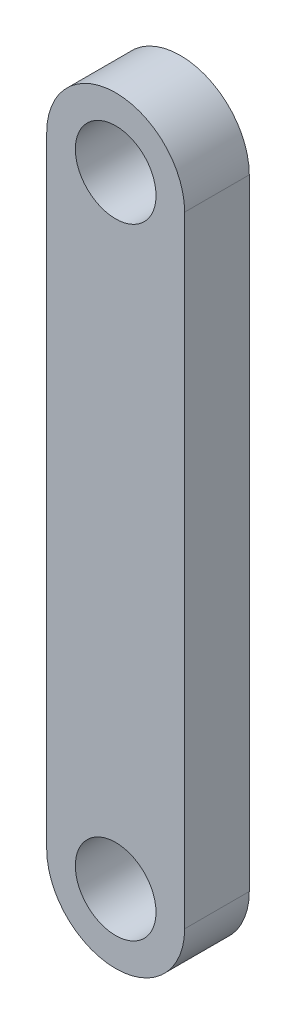
ISO-10303-21;
HEADER;
FILE_DESCRIPTION(('STEP AP214'),'2;1');
FILE_NAME('part.step','',(''),(''),'','','');
FILE_SCHEMA(('AUTOMOTIVE_DESIGN { 1 0 10303 214 1 1 1 1 }'));
ENDSEC;
DATA;
#1=APPLICATION_CONTEXT('core data for automotive mechanical design processes');
#2=APPLICATION_PROTOCOL_DEFINITION('international standard','automotive_design',2000,#1);
#3=PRODUCT_CONTEXT('',#1,'mechanical');
#4=PRODUCT('Part','Part','',(#3));
#5=PRODUCT_RELATED_PRODUCT_CATEGORY('part','',(#4));
#6=PRODUCT_DEFINITION_FORMATION('','',#4);
#7=PRODUCT_DEFINITION_CONTEXT('part definition',#1,'design');
#8=PRODUCT_DEFINITION('design','',#6,#7);
#9=PRODUCT_DEFINITION_SHAPE('','',#8);
#10=(LENGTH_UNIT() NAMED_UNIT(*) SI_UNIT(.MILLI.,.METRE.));
#11=(NAMED_UNIT(*) PLANE_ANGLE_UNIT() SI_UNIT($,.RADIAN.));
#12=(NAMED_UNIT(*) SI_UNIT($,.STERADIAN.) SOLID_ANGLE_UNIT());
#13=UNCERTAINTY_MEASURE_WITH_UNIT(LENGTH_MEASURE(1.E-05),#10,'distance_accuracy_value','');
#14=(GEOMETRIC_REPRESENTATION_CONTEXT(3) GLOBAL_UNCERTAINTY_ASSIGNED_CONTEXT((#13)) GLOBAL_UNIT_ASSIGNED_CONTEXT((#10,
#11,#12)) REPRESENTATION_CONTEXT('',''));
#15=CARTESIAN_POINT('',(0.,0.,0.));
#16=DIRECTION('',(0.,0.,1.));
#17=DIRECTION('',(1.,0.,0.));
#18=AXIS2_PLACEMENT_3D('',#15,#16,#17);
#19=CARTESIAN_POINT('',(0.,28.8,3.));
#20=DIRECTION('',(0.,0.,1.));
#21=DIRECTION('',(1.,0.,0.));
#22=AXIS2_PLACEMENT_3D('',#19,#20,#21);
#23=PLANE('',#22);
#24=CARTESIAN_POINT('',(0.,0.,3.));
#25=DIRECTION('',(0.,0.,1.));
#26=DIRECTION('',(1.,0.,0.));
#27=AXIS2_PLACEMENT_3D('',#24,#25,#26);
#28=CIRCLE('',#27,1.872);
#29=CARTESIAN_POINT('',(1.872,0.,3.));
#30=VERTEX_POINT('',#29);
#31=EDGE_CURVE('E110',#30,#30,#28,.T.);
#32=ORIENTED_EDGE('',*,*,#31,.F.);
#33=EDGE_LOOP('',(#32));
#34=FACE_BOUND('',#33,.T.);
#35=CARTESIAN_POINT('',(0.,28.8,3.));
#36=DIRECTION('',(0.,0.,1.));
#37=DIRECTION('',(1.,0.,0.));
#38=AXIS2_PLACEMENT_3D('',#35,#36,#37);
#39=CIRCLE('',#38,3.2);
#40=CARTESIAN_POINT('',(3.2,28.8,3.));
#41=VERTEX_POINT('',#40);
#42=CARTESIAN_POINT('',(-3.2,28.8,3.));
#43=VERTEX_POINT('',#42);
#44=EDGE_CURVE('E95',#41,#43,#39,.T.);
#45=ORIENTED_EDGE('',*,*,#44,.T.);
#46=DIRECTION('',(0.,-1.,0.));
#47=VECTOR('',#46,1.);
#48=CARTESIAN_POINT('',(-3.2,28.8,3.));
#49=LINE('',#48,#47);
#50=CARTESIAN_POINT('',(-3.19999999999999,0.,3.));
#51=VERTEX_POINT('',#50);
#52=EDGE_CURVE('E90',#43,#51,#49,.T.);
#53=ORIENTED_EDGE('',*,*,#52,.T.);
#54=CARTESIAN_POINT('',(0.,0.,3.));
#55=DIRECTION('',(0.,0.,1.));
#56=DIRECTION('',(1.,0.,0.));
#57=AXIS2_PLACEMENT_3D('',#54,#55,#56);
#58=CIRCLE('',#57,3.19999999999999);
#59=CARTESIAN_POINT('',(3.19999999999999,0.,3.));
#60=VERTEX_POINT('',#59);
#61=EDGE_CURVE('E93',#51,#60,#58,.T.);
#62=ORIENTED_EDGE('',*,*,#61,.T.);
#63=DIRECTION('',(0.,1.,0.));
#64=VECTOR('',#63,1.);
#65=CARTESIAN_POINT('',(3.2,28.8,3.));
#66=LINE('',#65,#64);
#67=EDGE_CURVE('E60',#60,#41,#66,.T.);
#68=ORIENTED_EDGE('',*,*,#67,.T.);
#69=EDGE_LOOP('',(#45,#53,#62,#68));
#70=FACE_BOUND('',#69,.T.);
#71=CARTESIAN_POINT('',(0.,28.8,3.));
#72=DIRECTION('',(0.,0.,1.));
#73=DIRECTION('',(1.,0.,0.));
#74=AXIS2_PLACEMENT_3D('',#71,#72,#73);
#75=CIRCLE('',#74,1.872);
#76=CARTESIAN_POINT('',(1.872,28.8,3.));
#77=VERTEX_POINT('',#76);
#78=EDGE_CURVE('E125',#77,#77,#75,.T.);
#79=ORIENTED_EDGE('',*,*,#78,.F.);
#80=EDGE_LOOP('',(#79));
#81=FACE_BOUND('',#80,.T.);
#82=ADVANCED_FACE('F43',(#34,#70,#81),#23,.T.);
#83=CARTESIAN_POINT('',(0.,28.8,0.));
#84=DIRECTION('',(0.,0.,1.));
#85=DIRECTION('',(1.,0.,0.));
#86=AXIS2_PLACEMENT_3D('',#83,#84,#85);
#87=PLANE('',#86);
#88=CARTESIAN_POINT('',(0.,28.8,0.));
#89=DIRECTION('',(0.,0.,1.));
#90=DIRECTION('',(1.,0.,0.));
#91=AXIS2_PLACEMENT_3D('',#88,#89,#90);
#92=CIRCLE('',#91,3.2);
#93=CARTESIAN_POINT('',(3.2,28.8,0.));
#94=VERTEX_POINT('',#93);
#95=CARTESIAN_POINT('',(-3.2,28.8,0.));
#96=VERTEX_POINT('',#95);
#97=EDGE_CURVE('E107',#94,#96,#92,.T.);
#98=ORIENTED_EDGE('',*,*,#97,.F.);
#99=DIRECTION('',(0.,1.,0.));
#100=VECTOR('',#99,1.);
#101=CARTESIAN_POINT('',(3.2,28.8,0.));
#102=LINE('',#101,#100);
#103=CARTESIAN_POINT('',(3.19999999999999,0.,0.));
#104=VERTEX_POINT('',#103);
#105=EDGE_CURVE('E83',#104,#94,#102,.T.);
#106=ORIENTED_EDGE('',*,*,#105,.F.);
#107=CARTESIAN_POINT('',(0.,0.,0.));
#108=DIRECTION('',(0.,0.,1.));
#109=DIRECTION('',(1.,0.,0.));
#110=AXIS2_PLACEMENT_3D('',#107,#108,#109);
#111=CIRCLE('',#110,3.19999999999999);
#112=CARTESIAN_POINT('',(-3.19999999999999,0.,0.));
#113=VERTEX_POINT('',#112);
#114=EDGE_CURVE('E77',#113,#104,#111,.T.);
#115=ORIENTED_EDGE('',*,*,#114,.F.);
#116=DIRECTION('',(0.,-1.,0.));
#117=VECTOR('',#116,1.);
#118=CARTESIAN_POINT('',(-3.2,28.8,0.));
#119=LINE('',#118,#117);
#120=EDGE_CURVE('E99',#96,#113,#119,.T.);
#121=ORIENTED_EDGE('',*,*,#120,.F.);
#122=EDGE_LOOP('',(#98,#106,#115,#121));
#123=FACE_BOUND('',#122,.T.);
#124=CARTESIAN_POINT('',(0.,0.,0.));
#125=DIRECTION('',(0.,0.,1.));
#126=DIRECTION('',(1.,0.,0.));
#127=AXIS2_PLACEMENT_3D('',#124,#125,#126);
#128=CIRCLE('',#127,1.872);
#129=CARTESIAN_POINT('',(1.872,0.,0.));
#130=VERTEX_POINT('',#129);
#131=EDGE_CURVE('E122',#130,#130,#128,.T.);
#132=ORIENTED_EDGE('',*,*,#131,.T.);
#133=EDGE_LOOP('',(#132));
#134=FACE_BOUND('',#133,.T.);
#135=CARTESIAN_POINT('',(0.,28.8,0.));
#136=DIRECTION('',(0.,0.,1.));
#137=DIRECTION('',(1.,0.,0.));
#138=AXIS2_PLACEMENT_3D('',#135,#136,#137);
#139=CIRCLE('',#138,1.872);
#140=CARTESIAN_POINT('',(1.872,28.8,0.));
#141=VERTEX_POINT('',#140);
#142=EDGE_CURVE('E128',#141,#141,#139,.T.);
#143=ORIENTED_EDGE('',*,*,#142,.T.);
#144=EDGE_LOOP('',(#143));
#145=FACE_BOUND('',#144,.T.);
#146=ADVANCED_FACE('F118',(#123,#134,#145),#87,.F.);
#147=CARTESIAN_POINT('',(0.,28.8,3.));
#148=DIRECTION('',(0.,0.,-1.));
#149=DIRECTION('',(-1.,0.,0.));
#150=AXIS2_PLACEMENT_3D('',#147,#148,#149);
#151=CYLINDRICAL_SURFACE('',#150,3.2);
#152=ORIENTED_EDGE('',*,*,#97,.T.);
#153=DIRECTION('',(0.,0.,-1.));
#154=VECTOR('',#153,1.);
#155=CARTESIAN_POINT('',(-3.2,28.8,3.));
#156=LINE('',#155,#154);
#157=EDGE_CURVE('E11',#43,#96,#156,.T.);
#158=ORIENTED_EDGE('',*,*,#157,.F.);
#159=ORIENTED_EDGE('',*,*,#44,.F.);
#160=DIRECTION('',(0.,0.,-1.));
#161=VECTOR('',#160,1.);
#162=CARTESIAN_POINT('',(3.2,28.8,3.));
#163=LINE('',#162,#161);
#164=EDGE_CURVE('E103',#41,#94,#163,.T.);
#165=ORIENTED_EDGE('',*,*,#164,.T.);
#166=EDGE_LOOP('',(#152,#158,#159,#165));
#167=FACE_BOUND('',#166,.T.);
#168=ADVANCED_FACE('F45',(#167),#151,.T.);
#169=CARTESIAN_POINT('',(-3.2,28.8,3.));
#170=DIRECTION('',(1.,0.,0.));
#171=DIRECTION('',(0.,1.,0.));
#172=AXIS2_PLACEMENT_3D('',#169,#170,#171);
#173=PLANE('',#172);
#174=ORIENTED_EDGE('',*,*,#120,.T.);
#175=DIRECTION('',(0.,0.,-1.));
#176=VECTOR('',#175,1.);
#177=CARTESIAN_POINT('',(-3.19999999999999,0.,3.));
#178=LINE('',#177,#176);
#179=EDGE_CURVE('E52',#51,#113,#178,.T.);
#180=ORIENTED_EDGE('',*,*,#179,.F.);
#181=ORIENTED_EDGE('',*,*,#52,.F.);
#182=ORIENTED_EDGE('',*,*,#157,.T.);
#183=EDGE_LOOP('',(#174,#180,#181,#182));
#184=FACE_BOUND('',#183,.T.);
#185=ADVANCED_FACE('F98',(#184),#173,.F.);
#186=CARTESIAN_POINT('',(0.,0.,3.));
#187=DIRECTION('',(0.,0.,-1.));
#188=DIRECTION('',(-1.,0.,0.));
#189=AXIS2_PLACEMENT_3D('',#186,#187,#188);
#190=CYLINDRICAL_SURFACE('',#189,3.19999999999999);
#191=ORIENTED_EDGE('',*,*,#114,.T.);
#192=DIRECTION('',(0.,0.,-1.));
#193=VECTOR('',#192,1.);
#194=CARTESIAN_POINT('',(3.19999999999999,0.,3.));
#195=LINE('',#194,#193);
#196=EDGE_CURVE('E100',#60,#104,#195,.T.);
#197=ORIENTED_EDGE('',*,*,#196,.F.);
#198=ORIENTED_EDGE('',*,*,#61,.F.);
#199=ORIENTED_EDGE('',*,*,#179,.T.);
#200=EDGE_LOOP('',(#191,#197,#198,#199));
#201=FACE_BOUND('',#200,.T.);
#202=ADVANCED_FACE('F101',(#201),#190,.T.);
#203=CARTESIAN_POINT('',(3.2,28.8,3.));
#204=DIRECTION('',(-1.,0.,0.));
#205=DIRECTION('',(0.,-1.,0.));
#206=AXIS2_PLACEMENT_3D('',#203,#204,#205);
#207=PLANE('',#206);
#208=ORIENTED_EDGE('',*,*,#105,.T.);
#209=ORIENTED_EDGE('',*,*,#164,.F.);
#210=ORIENTED_EDGE('',*,*,#67,.F.);
#211=ORIENTED_EDGE('',*,*,#196,.T.);
#212=EDGE_LOOP('',(#208,#209,#210,#211));
#213=FACE_BOUND('',#212,.T.);
#214=ADVANCED_FACE('F115',(#213),#207,.F.);
#215=CARTESIAN_POINT('',(0.,0.,3.));
#216=DIRECTION('',(0.,0.,-1.));
#217=DIRECTION('',(-1.,0.,0.));
#218=AXIS2_PLACEMENT_3D('',#215,#216,#217);
#219=CYLINDRICAL_SURFACE('',#218,1.872);
#220=ORIENTED_EDGE('',*,*,#31,.T.);
#221=EDGE_LOOP('',(#220));
#222=FACE_BOUND('',#221,.T.);
#223=ORIENTED_EDGE('',*,*,#131,.F.);
#224=EDGE_LOOP('',(#223));
#225=FACE_BOUND('',#224,.T.);
#226=ADVANCED_FACE('F145',(#222,#225),#219,.F.);
#227=CARTESIAN_POINT('',(0.,28.8,3.));
#228=DIRECTION('',(0.,0.,-1.));
#229=DIRECTION('',(-1.,0.,0.));
#230=AXIS2_PLACEMENT_3D('',#227,#228,#229);
#231=CYLINDRICAL_SURFACE('',#230,1.872);
#232=ORIENTED_EDGE('',*,*,#78,.T.);
#233=EDGE_LOOP('',(#232));
#234=FACE_BOUND('',#233,.T.);
#235=ORIENTED_EDGE('',*,*,#142,.F.);
#236=EDGE_LOOP('',(#235));
#237=FACE_BOUND('',#236,.T.);
#238=ADVANCED_FACE('F134',(#234,#237),#231,.F.);
#239=CLOSED_SHELL('',(#82,#146,#168,#185,#202,#214,#226,#238));
#240=MANIFOLD_SOLID_BREP('B2',#239);
#241=ADVANCED_BREP_SHAPE_REPRESENTATION('',(#18,#240),#14);
#242=SHAPE_DEFINITION_REPRESENTATION(#9,#241);
ENDSEC;
END-ISO-10303-21;
